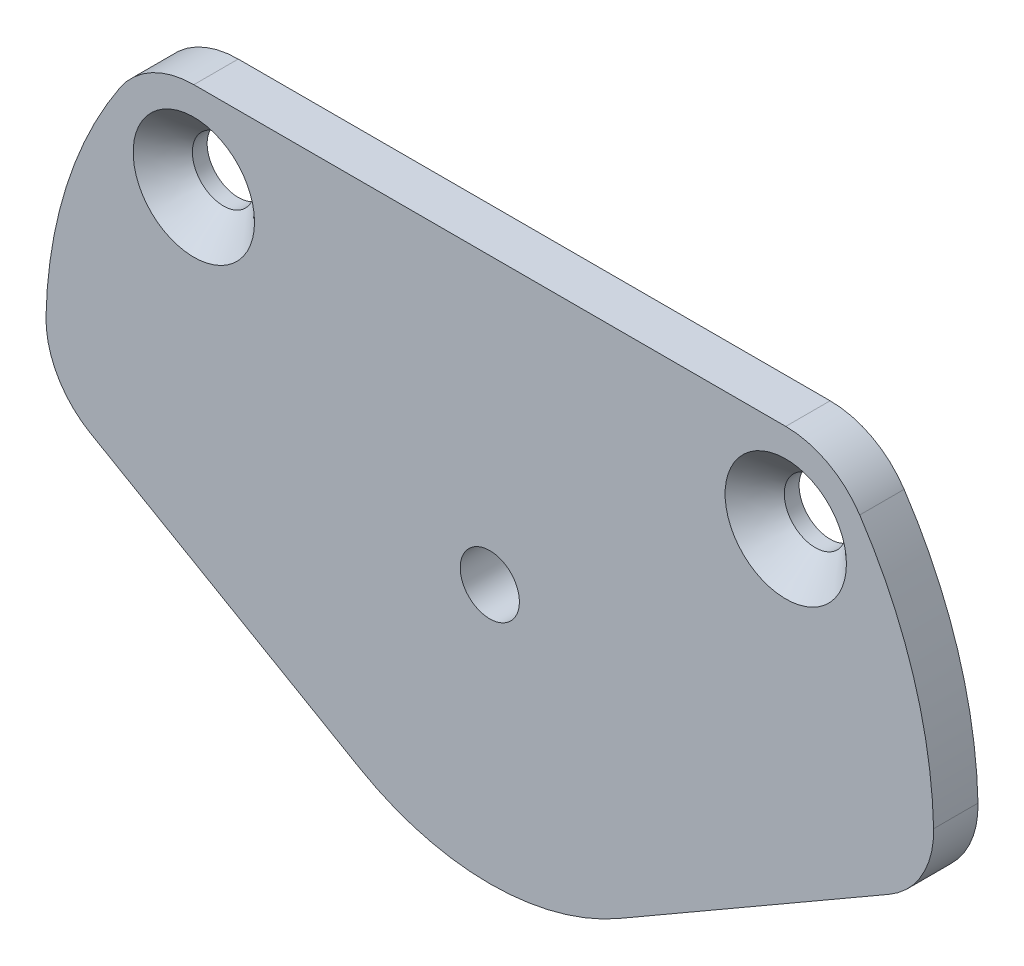
ISO-10303-21;
HEADER;
FILE_DESCRIPTION(('STEP AP214'),'2;1');
FILE_NAME('part.step','',(''),(''),'','','');
FILE_SCHEMA(('AUTOMOTIVE_DESIGN { 1 0 10303 214 1 1 1 1 }'));
ENDSEC;
DATA;
#1=APPLICATION_CONTEXT('core data for automotive mechanical design processes');
#2=APPLICATION_PROTOCOL_DEFINITION('international standard','automotive_design',2000,#1);
#3=PRODUCT_CONTEXT('',#1,'mechanical');
#4=PRODUCT('Part','Part','',(#3));
#5=PRODUCT_RELATED_PRODUCT_CATEGORY('part','',(#4));
#6=PRODUCT_DEFINITION_FORMATION('','',#4);
#7=PRODUCT_DEFINITION_CONTEXT('part definition',#1,'design');
#8=PRODUCT_DEFINITION('design','',#6,#7);
#9=PRODUCT_DEFINITION_SHAPE('','',#8);
#10=(LENGTH_UNIT() NAMED_UNIT(*) SI_UNIT(.MILLI.,.METRE.));
#11=(NAMED_UNIT(*) PLANE_ANGLE_UNIT() SI_UNIT($,.RADIAN.));
#12=(NAMED_UNIT(*) SI_UNIT($,.STERADIAN.) SOLID_ANGLE_UNIT());
#13=UNCERTAINTY_MEASURE_WITH_UNIT(LENGTH_MEASURE(1.E-05),#10,'distance_accuracy_value','');
#14=(GEOMETRIC_REPRESENTATION_CONTEXT(3) GLOBAL_UNCERTAINTY_ASSIGNED_CONTEXT((#13)) GLOBAL_UNIT_ASSIGNED_CONTEXT((#10,
#11,#12)) REPRESENTATION_CONTEXT('',''));
#15=CARTESIAN_POINT('',(0.,0.,0.));
#16=DIRECTION('',(0.,0.,1.));
#17=DIRECTION('',(1.,0.,0.));
#18=AXIS2_PLACEMENT_3D('',#15,#16,#17);
#19=CARTESIAN_POINT('',(-20.,13.2664991614216,1.5));
#20=DIRECTION('',(0.,0.,1.));
#21=DIRECTION('',(1.,0.,0.));
#22=AXIS2_PLACEMENT_3D('',#19,#20,#21);
#23=PLANE('',#22);
#24=CARTESIAN_POINT('',(20.,13.2664991614216,1.5));
#25=DIRECTION('',(0.,0.,1.));
#26=DIRECTION('',(1.,0.,0.));
#27=AXIS2_PLACEMENT_3D('',#24,#25,#26);
#28=CIRCLE('',#27,4.10000000000001);
#29=CARTESIAN_POINT('',(24.1,13.2664991614216,1.5));
#30=VERTEX_POINT('',#29);
#31=EDGE_CURVE('E47',#30,#30,#28,.F.);
#32=ORIENTED_EDGE('',*,*,#31,.T.);
#33=EDGE_LOOP('',(#32));
#34=FACE_BOUND('',#33,.T.);
#35=CARTESIAN_POINT('',(-20.,13.2664991614216,1.5));
#36=DIRECTION('',(0.,0.,1.));
#37=DIRECTION('',(1.,0.,0.));
#38=AXIS2_PLACEMENT_3D('',#35,#36,#37);
#39=CIRCLE('',#38,4.10000000000001);
#40=CARTESIAN_POINT('',(-15.9,13.2664991614216,1.5));
#41=VERTEX_POINT('',#40);
#42=EDGE_CURVE('E191',#41,#41,#39,.F.);
#43=ORIENTED_EDGE('',*,*,#42,.T.);
#44=EDGE_LOOP('',(#43));
#45=FACE_BOUND('',#44,.T.);
#46=CARTESIAN_POINT('',(-20.,13.2664991614216,1.5));
#47=DIRECTION('',(0.,0.,1.));
#48=DIRECTION('',(1.,0.,0.));
#49=AXIS2_PLACEMENT_3D('',#46,#47,#48);
#50=CIRCLE('',#49,6.);
#51=CARTESIAN_POINT('',(-20.,19.2664991614216,1.5));
#52=VERTEX_POINT('',#51);
#53=CARTESIAN_POINT('',(-25.,16.583123951777,1.5));
#54=VERTEX_POINT('',#53);
#55=EDGE_CURVE('E167',#52,#54,#50,.T.);
#56=ORIENTED_EDGE('',*,*,#55,.T.);
#57=CARTESIAN_POINT('',(0.,0.,1.5));
#58=DIRECTION('',(0.,0.,1.));
#59=DIRECTION('',(1.,0.,0.));
#60=AXIS2_PLACEMENT_3D('',#57,#58,#59);
#61=CIRCLE('',#60,30.);
#62=CARTESIAN_POINT('',(-29.9914367489475,0.716743841186787,1.5));
#63=VERTEX_POINT('',#62);
#64=EDGE_CURVE('E105',#54,#63,#61,.T.);
#65=ORIENTED_EDGE('',*,*,#64,.T.);
#66=CARTESIAN_POINT('',(-23.993149399158,0.573395072949429,1.5));
#67=DIRECTION('',(0.,0.,1.));
#68=DIRECTION('',(1.,0.,0.));
#69=AXIS2_PLACEMENT_3D('',#66,#67,#68);
#70=CIRCLE('',#69,6.);
#71=CARTESIAN_POINT('',(-26.993149399158,-4.6227573497572,1.5));
#72=VERTEX_POINT('',#71);
#73=EDGE_CURVE('E224',#63,#72,#70,.T.);
#74=ORIENTED_EDGE('',*,*,#73,.T.);
#75=DIRECTION('',(0.866025403784438,-0.500000000000001,0.));
#76=VECTOR('',#75,1.);
#77=CARTESIAN_POINT('',(-26.993149399158,-4.6227573497572,1.5));
#78=LINE('',#77,#76);
#79=CARTESIAN_POINT('',(-8.75000000000002,-15.1554445662277,1.5));
#80=VERTEX_POINT('',#79);
#81=EDGE_CURVE('E226',#72,#80,#78,.T.);
#82=ORIENTED_EDGE('',*,*,#81,.T.);
#83=CARTESIAN_POINT('',(0.,0.,1.5));
#84=DIRECTION('',(0.,0.,1.));
#85=DIRECTION('',(1.,0.,0.));
#86=AXIS2_PLACEMENT_3D('',#83,#84,#85);
#87=CIRCLE('',#86,17.5);
#88=CARTESIAN_POINT('',(8.75000000000002,-15.1554445662277,1.5));
#89=VERTEX_POINT('',#88);
#90=EDGE_CURVE('E228',#80,#89,#87,.T.);
#91=ORIENTED_EDGE('',*,*,#90,.T.);
#92=DIRECTION('',(0.866025403784438,0.500000000000001,0.));
#93=VECTOR('',#92,1.);
#94=CARTESIAN_POINT('',(8.75000000000002,-15.1554445662277,1.5));
#95=LINE('',#94,#93);
#96=CARTESIAN_POINT('',(26.993149399158,-4.6227573497572,1.5));
#97=VERTEX_POINT('',#96);
#98=EDGE_CURVE('E230',#89,#97,#95,.T.);
#99=ORIENTED_EDGE('',*,*,#98,.T.);
#100=CARTESIAN_POINT('',(23.993149399158,0.573395072949429,1.5));
#101=DIRECTION('',(0.,0.,1.));
#102=DIRECTION('',(1.,0.,0.));
#103=AXIS2_PLACEMENT_3D('',#100,#101,#102);
#104=CIRCLE('',#103,6.);
#105=CARTESIAN_POINT('',(29.9914367489475,0.716743841186786,1.5));
#106=VERTEX_POINT('',#105);
#107=EDGE_CURVE('E130',#97,#106,#104,.T.);
#108=ORIENTED_EDGE('',*,*,#107,.T.);
#109=CARTESIAN_POINT('',(0.,0.,1.5));
#110=DIRECTION('',(0.,0.,1.));
#111=DIRECTION('',(1.,0.,0.));
#112=AXIS2_PLACEMENT_3D('',#109,#110,#111);
#113=CIRCLE('',#112,30.);
#114=CARTESIAN_POINT('',(25.,16.583123951777,1.5));
#115=VERTEX_POINT('',#114);
#116=EDGE_CURVE('E124',#106,#115,#113,.T.);
#117=ORIENTED_EDGE('',*,*,#116,.T.);
#118=CARTESIAN_POINT('',(20.,13.2664991614216,1.5));
#119=DIRECTION('',(0.,0.,1.));
#120=DIRECTION('',(1.,0.,0.));
#121=AXIS2_PLACEMENT_3D('',#118,#119,#120);
#122=CIRCLE('',#121,6.);
#123=CARTESIAN_POINT('',(20.,19.2664991614216,1.5));
#124=VERTEX_POINT('',#123);
#125=EDGE_CURVE('E128',#115,#124,#122,.T.);
#126=ORIENTED_EDGE('',*,*,#125,.T.);
#127=DIRECTION('',(-1.,0.,0.));
#128=VECTOR('',#127,1.);
#129=CARTESIAN_POINT('',(-20.,19.2664991614216,1.5));
#130=LINE('',#129,#128);
#131=EDGE_CURVE('E55',#124,#52,#130,.T.);
#132=ORIENTED_EDGE('',*,*,#131,.T.);
#133=EDGE_LOOP('',(#56,#65,#74,#82,#91,#99,#108,#117,#126,#132));
#134=FACE_BOUND('',#133,.T.);
#135=CARTESIAN_POINT('',(0.,0.,1.5));
#136=DIRECTION('',(0.,0.,1.));
#137=DIRECTION('',(1.,0.,0.));
#138=AXIS2_PLACEMENT_3D('',#135,#136,#137);
#139=CIRCLE('',#138,2.);
#140=CARTESIAN_POINT('',(2.,0.,1.5));
#141=VERTEX_POINT('',#140);
#142=EDGE_CURVE('E213',#141,#141,#139,.T.);
#143=ORIENTED_EDGE('',*,*,#142,.F.);
#144=EDGE_LOOP('',(#143));
#145=FACE_BOUND('',#144,.T.);
#146=ADVANCED_FACE('F37',(#34,#45,#134,#145),#23,.T.);
#147=CARTESIAN_POINT('',(-20.,13.2664991614216,-1.5));
#148=DIRECTION('',(0.,0.,1.));
#149=DIRECTION('',(1.,0.,0.));
#150=AXIS2_PLACEMENT_3D('',#147,#148,#149);
#151=PLANE('',#150);
#152=CARTESIAN_POINT('',(-20.,13.2664991614216,-1.5));
#153=DIRECTION('',(0.,0.,1.));
#154=DIRECTION('',(1.,0.,0.));
#155=AXIS2_PLACEMENT_3D('',#152,#153,#154);
#156=CIRCLE('',#155,6.);
#157=CARTESIAN_POINT('',(-20.,19.2664991614216,-1.5));
#158=VERTEX_POINT('',#157);
#159=CARTESIAN_POINT('',(-25.,16.583123951777,-1.5));
#160=VERTEX_POINT('',#159);
#161=EDGE_CURVE('E148',#158,#160,#156,.T.);
#162=ORIENTED_EDGE('',*,*,#161,.F.);
#163=DIRECTION('',(-1.,0.,0.));
#164=VECTOR('',#163,1.);
#165=CARTESIAN_POINT('',(-20.,19.2664991614216,-1.5));
#166=LINE('',#165,#164);
#167=CARTESIAN_POINT('',(20.,19.2664991614216,-1.5));
#168=VERTEX_POINT('',#167);
#169=EDGE_CURVE('E96',#168,#158,#166,.T.);
#170=ORIENTED_EDGE('',*,*,#169,.F.);
#171=CARTESIAN_POINT('',(20.,13.2664991614216,-1.5));
#172=DIRECTION('',(0.,0.,1.));
#173=DIRECTION('',(1.,0.,0.));
#174=AXIS2_PLACEMENT_3D('',#171,#172,#173);
#175=CIRCLE('',#174,6.);
#176=CARTESIAN_POINT('',(25.,16.583123951777,-1.5));
#177=VERTEX_POINT('',#176);
#178=EDGE_CURVE('E90',#177,#168,#175,.T.);
#179=ORIENTED_EDGE('',*,*,#178,.F.);
#180=CARTESIAN_POINT('',(0.,0.,-1.5));
#181=DIRECTION('',(0.,0.,1.));
#182=DIRECTION('',(1.,0.,0.));
#183=AXIS2_PLACEMENT_3D('',#180,#181,#182);
#184=CIRCLE('',#183,30.);
#185=CARTESIAN_POINT('',(29.9914367489475,0.716743841186786,-1.5));
#186=VERTEX_POINT('',#185);
#187=EDGE_CURVE('E138',#186,#177,#184,.T.);
#188=ORIENTED_EDGE('',*,*,#187,.F.);
#189=CARTESIAN_POINT('',(23.993149399158,0.573395072949429,-1.5));
#190=DIRECTION('',(0.,0.,1.));
#191=DIRECTION('',(1.,0.,0.));
#192=AXIS2_PLACEMENT_3D('',#189,#190,#191);
#193=CIRCLE('',#192,6.);
#194=CARTESIAN_POINT('',(26.993149399158,-4.6227573497572,-1.5));
#195=VERTEX_POINT('',#194);
#196=EDGE_CURVE('E162',#195,#186,#193,.T.);
#197=ORIENTED_EDGE('',*,*,#196,.F.);
#198=DIRECTION('',(0.866025403784438,0.500000000000001,0.));
#199=VECTOR('',#198,1.);
#200=CARTESIAN_POINT('',(8.75000000000002,-15.1554445662277,-1.5));
#201=LINE('',#200,#199);
#202=CARTESIAN_POINT('',(8.75000000000002,-15.1554445662277,-1.5));
#203=VERTEX_POINT('',#202);
#204=EDGE_CURVE('E160',#203,#195,#201,.T.);
#205=ORIENTED_EDGE('',*,*,#204,.F.);
#206=CARTESIAN_POINT('',(0.,0.,-1.5));
#207=DIRECTION('',(0.,0.,1.));
#208=DIRECTION('',(1.,0.,0.));
#209=AXIS2_PLACEMENT_3D('',#206,#207,#208);
#210=CIRCLE('',#209,17.5);
#211=CARTESIAN_POINT('',(-8.75000000000002,-15.1554445662277,-1.5));
#212=VERTEX_POINT('',#211);
#213=EDGE_CURVE('E158',#212,#203,#210,.T.);
#214=ORIENTED_EDGE('',*,*,#213,.F.);
#215=DIRECTION('',(0.866025403784438,-0.500000000000001,0.));
#216=VECTOR('',#215,1.);
#217=CARTESIAN_POINT('',(-26.993149399158,-4.6227573497572,-1.5));
#218=LINE('',#217,#216);
#219=CARTESIAN_POINT('',(-26.993149399158,-4.6227573497572,-1.5));
#220=VERTEX_POINT('',#219);
#221=EDGE_CURVE('E156',#220,#212,#218,.T.);
#222=ORIENTED_EDGE('',*,*,#221,.F.);
#223=CARTESIAN_POINT('',(-23.993149399158,0.573395072949429,-1.5));
#224=DIRECTION('',(0.,0.,1.));
#225=DIRECTION('',(1.,0.,0.));
#226=AXIS2_PLACEMENT_3D('',#223,#224,#225);
#227=CIRCLE('',#226,6.);
#228=CARTESIAN_POINT('',(-29.9914367489475,0.716743841186787,-1.5));
#229=VERTEX_POINT('',#228);
#230=EDGE_CURVE('E154',#229,#220,#227,.T.);
#231=ORIENTED_EDGE('',*,*,#230,.F.);
#232=CARTESIAN_POINT('',(0.,0.,-1.5));
#233=DIRECTION('',(0.,0.,1.));
#234=DIRECTION('',(1.,0.,0.));
#235=AXIS2_PLACEMENT_3D('',#232,#233,#234);
#236=CIRCLE('',#235,30.);
#237=EDGE_CURVE('E151',#160,#229,#236,.T.);
#238=ORIENTED_EDGE('',*,*,#237,.F.);
#239=EDGE_LOOP('',(#162,#170,#179,#188,#197,#205,#214,#222,#231,#238));
#240=FACE_BOUND('',#239,.T.);
#241=CARTESIAN_POINT('',(-20.,13.2664991614216,-1.5));
#242=DIRECTION('',(0.,0.,1.));
#243=DIRECTION('',(1.,0.,0.));
#244=AXIS2_PLACEMENT_3D('',#241,#242,#243);
#245=CIRCLE('',#244,2.1);
#246=CARTESIAN_POINT('',(-17.9,13.2664991614216,-1.5));
#247=VERTEX_POINT('',#246);
#248=EDGE_CURVE('E152',#247,#247,#245,.T.);
#249=ORIENTED_EDGE('',*,*,#248,.T.);
#250=EDGE_LOOP('',(#249));
#251=FACE_BOUND('',#250,.T.);
#252=CARTESIAN_POINT('',(20.,13.2664991614216,-1.5));
#253=DIRECTION('',(0.,0.,1.));
#254=DIRECTION('',(1.,0.,0.));
#255=AXIS2_PLACEMENT_3D('',#252,#253,#254);
#256=CIRCLE('',#255,2.1);
#257=CARTESIAN_POINT('',(22.1,13.2664991614216,-1.5));
#258=VERTEX_POINT('',#257);
#259=EDGE_CURVE('E211',#258,#258,#256,.T.);
#260=ORIENTED_EDGE('',*,*,#259,.T.);
#261=EDGE_LOOP('',(#260));
#262=FACE_BOUND('',#261,.T.);
#263=CARTESIAN_POINT('',(0.,0.,-1.5));
#264=DIRECTION('',(0.,0.,1.));
#265=DIRECTION('',(1.,0.,0.));
#266=AXIS2_PLACEMENT_3D('',#263,#264,#265);
#267=CIRCLE('',#266,2.);
#268=CARTESIAN_POINT('',(2.,0.,-1.5));
#269=VERTEX_POINT('',#268);
#270=EDGE_CURVE('E218',#269,#269,#267,.T.);
#271=ORIENTED_EDGE('',*,*,#270,.T.);
#272=EDGE_LOOP('',(#271));
#273=FACE_BOUND('',#272,.T.);
#274=ADVANCED_FACE('F243',(#240,#251,#262,#273),#151,.F.);
#275=CARTESIAN_POINT('',(-20.,13.2664991614216,1.5));
#276=DIRECTION('',(0.,0.,-1.));
#277=DIRECTION('',(-1.,0.,0.));
#278=AXIS2_PLACEMENT_3D('',#275,#276,#277);
#279=CYLINDRICAL_SURFACE('',#278,6.);
#280=ORIENTED_EDGE('',*,*,#161,.T.);
#281=DIRECTION('',(0.,0.,-1.));
#282=VECTOR('',#281,1.);
#283=CARTESIAN_POINT('',(-25.,16.583123951777,1.5));
#284=LINE('',#283,#282);
#285=EDGE_CURVE('E186',#54,#160,#284,.T.);
#286=ORIENTED_EDGE('',*,*,#285,.F.);
#287=ORIENTED_EDGE('',*,*,#55,.F.);
#288=DIRECTION('',(0.,0.,-1.));
#289=VECTOR('',#288,1.);
#290=CARTESIAN_POINT('',(-20.,19.2664991614216,1.5));
#291=LINE('',#290,#289);
#292=EDGE_CURVE('E144',#52,#158,#291,.T.);
#293=ORIENTED_EDGE('',*,*,#292,.T.);
#294=EDGE_LOOP('',(#280,#286,#287,#293));
#295=FACE_BOUND('',#294,.T.);
#296=ADVANCED_FACE('F248',(#295),#279,.T.);
#297=CARTESIAN_POINT('',(0.,0.,1.5));
#298=DIRECTION('',(0.,0.,-1.));
#299=DIRECTION('',(-1.,0.,0.));
#300=AXIS2_PLACEMENT_3D('',#297,#298,#299);
#301=CYLINDRICAL_SURFACE('',#300,30.);
#302=ORIENTED_EDGE('',*,*,#237,.T.);
#303=DIRECTION('',(0.,0.,-1.));
#304=VECTOR('',#303,1.);
#305=CARTESIAN_POINT('',(-29.9914367489475,0.716743841186787,1.5));
#306=LINE('',#305,#304);
#307=EDGE_CURVE('E183',#63,#229,#306,.T.);
#308=ORIENTED_EDGE('',*,*,#307,.F.);
#309=ORIENTED_EDGE('',*,*,#64,.F.);
#310=ORIENTED_EDGE('',*,*,#285,.T.);
#311=EDGE_LOOP('',(#302,#308,#309,#310));
#312=FACE_BOUND('',#311,.T.);
#313=ADVANCED_FACE('F360',(#312),#301,.T.);
#314=CARTESIAN_POINT('',(-23.993149399158,0.573395072949429,1.5));
#315=DIRECTION('',(0.,0.,-1.));
#316=DIRECTION('',(-1.,0.,0.));
#317=AXIS2_PLACEMENT_3D('',#314,#315,#316);
#318=CYLINDRICAL_SURFACE('',#317,6.);
#319=ORIENTED_EDGE('',*,*,#230,.T.);
#320=DIRECTION('',(0.,0.,-1.));
#321=VECTOR('',#320,1.);
#322=CARTESIAN_POINT('',(-26.993149399158,-4.6227573497572,1.5));
#323=LINE('',#322,#321);
#324=EDGE_CURVE('E180',#72,#220,#323,.T.);
#325=ORIENTED_EDGE('',*,*,#324,.F.);
#326=ORIENTED_EDGE('',*,*,#73,.F.);
#327=ORIENTED_EDGE('',*,*,#307,.T.);
#328=EDGE_LOOP('',(#319,#325,#326,#327));
#329=FACE_BOUND('',#328,.T.);
#330=ADVANCED_FACE('F351',(#329),#318,.T.);
#331=CARTESIAN_POINT('',(-26.993149399158,-4.6227573497572,1.5));
#332=DIRECTION('',(0.500000000000001,0.866025403784438,0.));
#333=DIRECTION('',(-0.866025403784438,0.500000000000001,0.));
#334=AXIS2_PLACEMENT_3D('',#331,#332,#333);
#335=PLANE('',#334);
#336=ORIENTED_EDGE('',*,*,#221,.T.);
#337=DIRECTION('',(0.,0.,-1.));
#338=VECTOR('',#337,1.);
#339=CARTESIAN_POINT('',(-8.75000000000002,-15.1554445662277,1.5));
#340=LINE('',#339,#338);
#341=EDGE_CURVE('E177',#80,#212,#340,.T.);
#342=ORIENTED_EDGE('',*,*,#341,.F.);
#343=ORIENTED_EDGE('',*,*,#81,.F.);
#344=ORIENTED_EDGE('',*,*,#324,.T.);
#345=EDGE_LOOP('',(#336,#342,#343,#344));
#346=FACE_BOUND('',#345,.T.);
#347=ADVANCED_FACE('F342',(#346),#335,.F.);
#348=CARTESIAN_POINT('',(0.,0.,1.5));
#349=DIRECTION('',(0.,0.,-1.));
#350=DIRECTION('',(-1.,0.,0.));
#351=AXIS2_PLACEMENT_3D('',#348,#349,#350);
#352=CYLINDRICAL_SURFACE('',#351,17.5);
#353=ORIENTED_EDGE('',*,*,#213,.T.);
#354=DIRECTION('',(0.,0.,-1.));
#355=VECTOR('',#354,1.);
#356=CARTESIAN_POINT('',(8.75000000000002,-15.1554445662277,1.5));
#357=LINE('',#356,#355);
#358=EDGE_CURVE('E174',#89,#203,#357,.T.);
#359=ORIENTED_EDGE('',*,*,#358,.F.);
#360=ORIENTED_EDGE('',*,*,#90,.F.);
#361=ORIENTED_EDGE('',*,*,#341,.T.);
#362=EDGE_LOOP('',(#353,#359,#360,#361));
#363=FACE_BOUND('',#362,.T.);
#364=ADVANCED_FACE('F334',(#363),#352,.T.);
#365=CARTESIAN_POINT('',(8.75000000000002,-15.1554445662277,1.5));
#366=DIRECTION('',(-0.500000000000001,0.866025403784438,0.));
#367=DIRECTION('',(-0.866025403784438,-0.500000000000001,0.));
#368=AXIS2_PLACEMENT_3D('',#365,#366,#367);
#369=PLANE('',#368);
#370=ORIENTED_EDGE('',*,*,#204,.T.);
#371=DIRECTION('',(0.,0.,-1.));
#372=VECTOR('',#371,1.);
#373=CARTESIAN_POINT('',(26.993149399158,-4.6227573497572,1.5));
#374=LINE('',#373,#372);
#375=EDGE_CURVE('E171',#97,#195,#374,.T.);
#376=ORIENTED_EDGE('',*,*,#375,.F.);
#377=ORIENTED_EDGE('',*,*,#98,.F.);
#378=ORIENTED_EDGE('',*,*,#358,.T.);
#379=EDGE_LOOP('',(#370,#376,#377,#378));
#380=FACE_BOUND('',#379,.T.);
#381=ADVANCED_FACE('F236',(#380),#369,.F.);
#382=CARTESIAN_POINT('',(23.993149399158,0.573395072949429,1.5));
#383=DIRECTION('',(0.,0.,-1.));
#384=DIRECTION('',(-1.,0.,0.));
#385=AXIS2_PLACEMENT_3D('',#382,#383,#384);
#386=CYLINDRICAL_SURFACE('',#385,6.);
#387=ORIENTED_EDGE('',*,*,#196,.T.);
#388=DIRECTION('',(0.,0.,-1.));
#389=VECTOR('',#388,1.);
#390=CARTESIAN_POINT('',(29.9914367489475,0.716743841186786,1.5));
#391=LINE('',#390,#389);
#392=EDGE_CURVE('E139',#106,#186,#391,.T.);
#393=ORIENTED_EDGE('',*,*,#392,.F.);
#394=ORIENTED_EDGE('',*,*,#107,.F.);
#395=ORIENTED_EDGE('',*,*,#375,.T.);
#396=EDGE_LOOP('',(#387,#393,#394,#395));
#397=FACE_BOUND('',#396,.T.);
#398=ADVANCED_FACE('F240',(#397),#386,.T.);
#399=CARTESIAN_POINT('',(0.,0.,1.5));
#400=DIRECTION('',(0.,0.,-1.));
#401=DIRECTION('',(-1.,0.,0.));
#402=AXIS2_PLACEMENT_3D('',#399,#400,#401);
#403=CYLINDRICAL_SURFACE('',#402,30.);
#404=ORIENTED_EDGE('',*,*,#187,.T.);
#405=DIRECTION('',(0.,0.,-1.));
#406=VECTOR('',#405,1.);
#407=CARTESIAN_POINT('',(25.,16.583123951777,1.5));
#408=LINE('',#407,#406);
#409=EDGE_CURVE('E135',#115,#177,#408,.T.);
#410=ORIENTED_EDGE('',*,*,#409,.F.);
#411=ORIENTED_EDGE('',*,*,#116,.F.);
#412=ORIENTED_EDGE('',*,*,#392,.T.);
#413=EDGE_LOOP('',(#404,#410,#411,#412));
#414=FACE_BOUND('',#413,.T.);
#415=ADVANCED_FACE('F136',(#414),#403,.T.);
#416=CARTESIAN_POINT('',(20.,13.2664991614216,1.5));
#417=DIRECTION('',(0.,0.,-1.));
#418=DIRECTION('',(-1.,0.,0.));
#419=AXIS2_PLACEMENT_3D('',#416,#417,#418);
#420=CYLINDRICAL_SURFACE('',#419,6.);
#421=ORIENTED_EDGE('',*,*,#178,.T.);
#422=DIRECTION('',(0.,0.,-1.));
#423=VECTOR('',#422,1.);
#424=CARTESIAN_POINT('',(20.,19.2664991614216,1.5));
#425=LINE('',#424,#423);
#426=EDGE_CURVE('E140',#124,#168,#425,.T.);
#427=ORIENTED_EDGE('',*,*,#426,.F.);
#428=ORIENTED_EDGE('',*,*,#125,.F.);
#429=ORIENTED_EDGE('',*,*,#409,.T.);
#430=EDGE_LOOP('',(#421,#427,#428,#429));
#431=FACE_BOUND('',#430,.T.);
#432=ADVANCED_FACE('F142',(#431),#420,.T.);
#433=CARTESIAN_POINT('',(-20.,19.2664991614216,1.5));
#434=DIRECTION('',(0.,-1.,0.));
#435=DIRECTION('',(0.,0.,-1.));
#436=AXIS2_PLACEMENT_3D('',#433,#434,#435);
#437=PLANE('',#436);
#438=ORIENTED_EDGE('',*,*,#169,.T.);
#439=ORIENTED_EDGE('',*,*,#292,.F.);
#440=ORIENTED_EDGE('',*,*,#131,.F.);
#441=ORIENTED_EDGE('',*,*,#426,.T.);
#442=EDGE_LOOP('',(#438,#439,#440,#441));
#443=FACE_BOUND('',#442,.T.);
#444=ADVANCED_FACE('F250',(#443),#437,.F.);
#445=CARTESIAN_POINT('',(-20.,13.2664991614216,1.5));
#446=DIRECTION('',(0.,0.,-1.));
#447=DIRECTION('',(-1.,0.,0.));
#448=AXIS2_PLACEMENT_3D('',#445,#446,#447);
#449=CYLINDRICAL_SURFACE('',#448,2.1);
#450=CARTESIAN_POINT('',(-20.,13.2664991614216,-0.499999999999999));
#451=DIRECTION('',(0.,0.,1.));
#452=DIRECTION('',(1.,0.,0.));
#453=AXIS2_PLACEMENT_3D('',#450,#451,#452);
#454=CIRCLE('',#453,2.1);
#455=CARTESIAN_POINT('',(-17.9,13.2664991614216,-0.499999999999999));
#456=VERTEX_POINT('',#455);
#457=EDGE_CURVE('E11',#456,#456,#454,.T.);
#458=ORIENTED_EDGE('',*,*,#457,.T.);
#459=EDGE_LOOP('',(#458));
#460=FACE_BOUND('',#459,.T.);
#461=ORIENTED_EDGE('',*,*,#248,.F.);
#462=EDGE_LOOP('',(#461));
#463=FACE_BOUND('',#462,.T.);
#464=ADVANCED_FACE('F207',(#460,#463),#449,.F.);
#465=CARTESIAN_POINT('',(20.,13.2664991614216,1.5));
#466=DIRECTION('',(0.,0.,-1.));
#467=DIRECTION('',(-1.,0.,0.));
#468=AXIS2_PLACEMENT_3D('',#465,#466,#467);
#469=CYLINDRICAL_SURFACE('',#468,2.1);
#470=CARTESIAN_POINT('',(20.,13.2664991614216,-0.499999999999999));
#471=DIRECTION('',(0.,0.,1.));
#472=DIRECTION('',(1.,0.,0.));
#473=AXIS2_PLACEMENT_3D('',#470,#471,#472);
#474=CIRCLE('',#473,2.1);
#475=CARTESIAN_POINT('',(22.1,13.2664991614216,-0.499999999999999));
#476=VERTEX_POINT('',#475);
#477=EDGE_CURVE('E188',#476,#476,#474,.T.);
#478=ORIENTED_EDGE('',*,*,#477,.T.);
#479=EDGE_LOOP('',(#478));
#480=FACE_BOUND('',#479,.T.);
#481=ORIENTED_EDGE('',*,*,#259,.F.);
#482=EDGE_LOOP('',(#481));
#483=FACE_BOUND('',#482,.T.);
#484=ADVANCED_FACE('F204',(#480,#483),#469,.F.);
#485=CARTESIAN_POINT('',(0.,0.,1.5));
#486=DIRECTION('',(0.,0.,-1.));
#487=DIRECTION('',(-1.,0.,0.));
#488=AXIS2_PLACEMENT_3D('',#485,#486,#487);
#489=CYLINDRICAL_SURFACE('',#488,2.);
#490=ORIENTED_EDGE('',*,*,#142,.T.);
#491=EDGE_LOOP('',(#490));
#492=FACE_BOUND('',#491,.T.);
#493=ORIENTED_EDGE('',*,*,#270,.F.);
#494=EDGE_LOOP('',(#493));
#495=FACE_BOUND('',#494,.T.);
#496=ADVANCED_FACE('F201',(#492,#495),#489,.F.);
#497=CARTESIAN_POINT('',(20.,13.2664991614216,-0.499999999999999));
#498=DIRECTION('',(0.,0.,1.));
#499=DIRECTION('',(1.,0.,0.));
#500=AXIS2_PLACEMENT_3D('',#497,#498,#499);
#501=CONICAL_SURFACE('',#500,2.1,0.78539816339745);
#502=ORIENTED_EDGE('',*,*,#31,.F.);
#503=EDGE_LOOP('',(#502));
#504=FACE_BOUND('',#503,.T.);
#505=ORIENTED_EDGE('',*,*,#477,.F.);
#506=EDGE_LOOP('',(#505));
#507=FACE_BOUND('',#506,.T.);
#508=ADVANCED_FACE('F198',(#504,#507),#501,.F.);
#509=CARTESIAN_POINT('',(-20.,13.2664991614216,-0.499999999999999));
#510=DIRECTION('',(0.,0.,1.));
#511=DIRECTION('',(1.,0.,0.));
#512=AXIS2_PLACEMENT_3D('',#509,#510,#511);
#513=CONICAL_SURFACE('',#512,2.1,0.78539816339745);
#514=ORIENTED_EDGE('',*,*,#42,.F.);
#515=EDGE_LOOP('',(#514));
#516=FACE_BOUND('',#515,.T.);
#517=ORIENTED_EDGE('',*,*,#457,.F.);
#518=EDGE_LOOP('',(#517));
#519=FACE_BOUND('',#518,.T.);
#520=ADVANCED_FACE('F40',(#516,#519),#513,.F.);
#521=CLOSED_SHELL('',(#146,#274,#296,#313,#330,#347,#364,#381,#398,#415,#432,#444,#464,#484,
#496,#508,#520));
#522=MANIFOLD_SOLID_BREP('B2',#521);
#523=ADVANCED_BREP_SHAPE_REPRESENTATION('',(#18,#522),#14);
#524=SHAPE_DEFINITION_REPRESENTATION(#9,#523);
ENDSEC;
END-ISO-10303-21;
